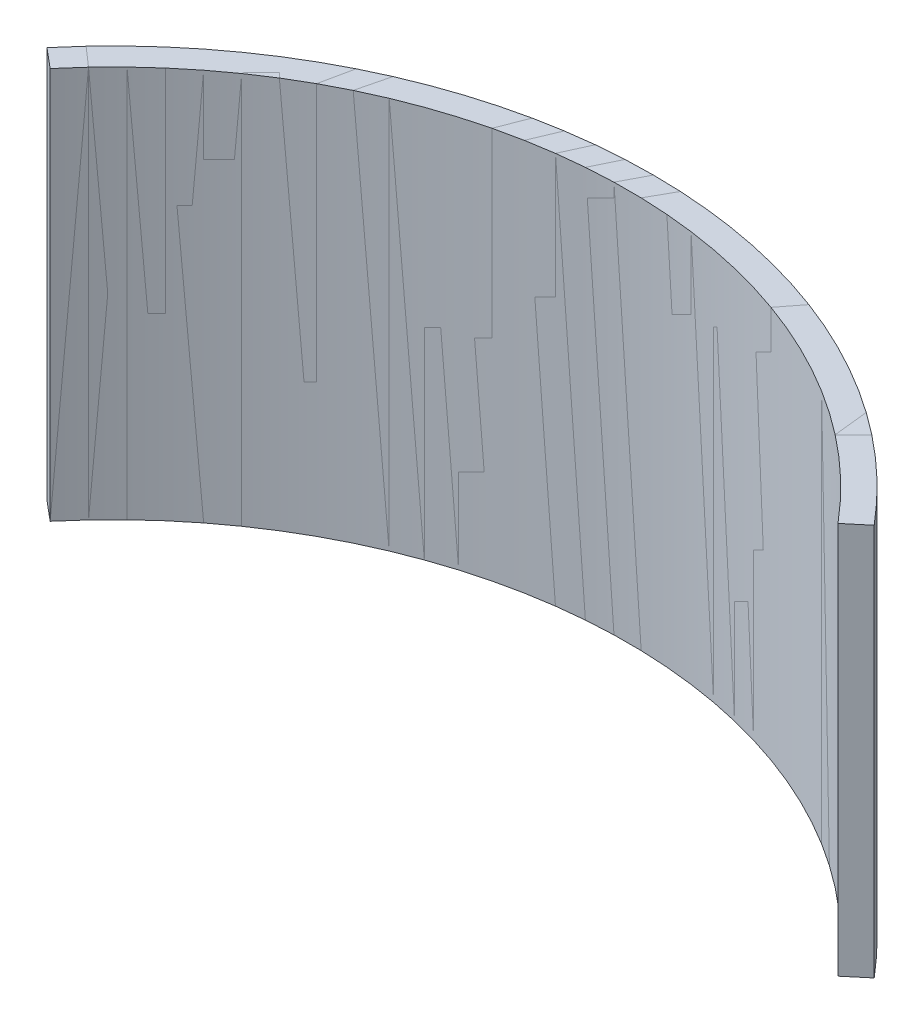
ISO-10303-21;
HEADER;
FILE_DESCRIPTION(('STEP AP214'),'2;1');
FILE_NAME('part.step','',(''),(''),'','','');
FILE_SCHEMA(('AUTOMOTIVE_DESIGN { 1 0 10303 214 1 1 1 1 }'));
ENDSEC;
DATA;
#1=APPLICATION_CONTEXT('core data for automotive mechanical design processes');
#2=APPLICATION_PROTOCOL_DEFINITION('international standard','automotive_design',2000,#1);
#3=PRODUCT_CONTEXT('',#1,'mechanical');
#4=PRODUCT('Part','Part','',(#3));
#5=PRODUCT_RELATED_PRODUCT_CATEGORY('part','',(#4));
#6=PRODUCT_DEFINITION_FORMATION('','',#4);
#7=PRODUCT_DEFINITION_CONTEXT('part definition',#1,'design');
#8=PRODUCT_DEFINITION('design','',#6,#7);
#9=PRODUCT_DEFINITION_SHAPE('','',#8);
#10=(LENGTH_UNIT() NAMED_UNIT(*) SI_UNIT(.MILLI.,.METRE.));
#11=(NAMED_UNIT(*) PLANE_ANGLE_UNIT() SI_UNIT($,.RADIAN.));
#12=(NAMED_UNIT(*) SI_UNIT($,.STERADIAN.) SOLID_ANGLE_UNIT());
#13=UNCERTAINTY_MEASURE_WITH_UNIT(LENGTH_MEASURE(1.E-05),#10,'distance_accuracy_value','');
#14=(GEOMETRIC_REPRESENTATION_CONTEXT(3) GLOBAL_UNCERTAINTY_ASSIGNED_CONTEXT((#13)) GLOBAL_UNIT_ASSIGNED_CONTEXT((#10,
#11,#12)) REPRESENTATION_CONTEXT('',''));
#15=CARTESIAN_POINT('',(0.,0.,0.));
#16=DIRECTION('',(0.,0.,1.));
#17=DIRECTION('',(1.,0.,0.));
#18=AXIS2_PLACEMENT_3D('',#15,#16,#17);
#19=CARTESIAN_POINT('',(30.6417777247592,17.,-25.7115043874616));
#20=DIRECTION('',(0.,1.,0.));
#21=DIRECTION('',(0.,0.,1.));
#22=AXIS2_PLACEMENT_3D('',#19,#20,#21);
#23=PLANE('',#22);
#24=DIRECTION('',(-0.766044443118979,0.,-0.642787609686538));
#25=VECTOR('',#24,1.);
#26=CARTESIAN_POINT('',(-30.6417777247592,17.,-25.7115043874616));
#27=LINE('',#26,#25);
#28=CARTESIAN_POINT('',(-30.6417777247592,17.,-25.7115043874616));
#29=VERTEX_POINT('',#28);
#30=CARTESIAN_POINT('',(-32.1738666109971,17.,-26.9970796068346));
#31=VERTEX_POINT('',#30);
#32=EDGE_CURVE('E92',#29,#31,#27,.T.);
#33=ORIENTED_EDGE('',*,*,#32,.T.);
#34=CARTESIAN_POINT('',(0.,17.,0.));
#35=DIRECTION('',(0.,1.,0.));
#36=DIRECTION('',(0.,0.,1.));
#37=AXIS2_PLACEMENT_3D('',#34,#35,#36);
#38=CIRCLE('',#37,42.);
#39=CARTESIAN_POINT('',(32.1738666109971,17.,-26.9970796068346));
#40=VERTEX_POINT('',#39);
#41=EDGE_CURVE('E142',#31,#40,#38,.F.);
#42=ORIENTED_EDGE('',*,*,#41,.T.);
#43=DIRECTION('',(0.766044443118979,0.,-0.642787609686538));
#44=VECTOR('',#43,1.);
#45=CARTESIAN_POINT('',(30.6417777247592,17.,-25.7115043874616));
#46=LINE('',#45,#44);
#47=CARTESIAN_POINT('',(30.6417777247592,17.,-25.7115043874616));
#48=VERTEX_POINT('',#47);
#49=EDGE_CURVE('E112',#48,#40,#46,.T.);
#50=ORIENTED_EDGE('',*,*,#49,.F.);
#51=CARTESIAN_POINT('',(0.,17.,0.));
#52=DIRECTION('',(0.,1.,0.));
#53=DIRECTION('',(0.,0.,1.));
#54=AXIS2_PLACEMENT_3D('',#51,#52,#53);
#55=CIRCLE('',#54,40.0000000000001);
#56=EDGE_CURVE('E110',#48,#29,#55,.T.);
#57=ORIENTED_EDGE('',*,*,#56,.T.);
#58=EDGE_LOOP('',(#33,#42,#50,#57));
#59=FACE_BOUND('',#58,.T.);
#60=ADVANCED_FACE('F68',(#59),#23,.F.);
#61=CARTESIAN_POINT('',(0.,0.,0.));
#62=DIRECTION('',(0.642787609686538,0.,0.766044443118979));
#63=DIRECTION('',(0.766044443118979,0.,-0.642787609686538));
#64=AXIS2_PLACEMENT_3D('',#61,#62,#63);
#65=PLANE('',#64);
#66=DIRECTION('',(0.,-1.,0.));
#67=VECTOR('',#66,1.);
#68=CARTESIAN_POINT('',(32.1738666109971,2.,-26.9970796068346));
#69=LINE('',#68,#67);
#70=CARTESIAN_POINT('',(32.1738666109971,47.5,-26.9970796068346));
#71=VERTEX_POINT('',#70);
#72=EDGE_CURVE('E77',#71,#40,#69,.T.);
#73=ORIENTED_EDGE('',*,*,#72,.F.);
#74=DIRECTION('',(-0.766044443118979,0.,0.642787609686538));
#75=VECTOR('',#74,1.);
#76=CARTESIAN_POINT('',(30.6417777247592,47.5,-25.7115043874616));
#77=LINE('',#76,#75);
#78=CARTESIAN_POINT('',(30.6417777247592,47.5,-25.7115043874615));
#79=VERTEX_POINT('',#78);
#80=EDGE_CURVE('E85',#71,#79,#77,.T.);
#81=ORIENTED_EDGE('',*,*,#80,.T.);
#82=DIRECTION('',(0.,-1.,0.));
#83=VECTOR('',#82,1.);
#84=CARTESIAN_POINT('',(30.6417777247592,47.5,-25.7115043874616));
#85=LINE('',#84,#83);
#86=EDGE_CURVE('E130',#79,#48,#85,.T.);
#87=ORIENTED_EDGE('',*,*,#86,.T.);
#88=ORIENTED_EDGE('',*,*,#49,.T.);
#89=EDGE_LOOP('',(#73,#81,#87,#88));
#90=FACE_BOUND('',#89,.T.);
#91=ADVANCED_FACE('F152',(#90),#65,.T.);
#92=CARTESIAN_POINT('',(0.,47.5,0.));
#93=DIRECTION('',(0.,1.,0.));
#94=DIRECTION('',(0.,0.,1.));
#95=AXIS2_PLACEMENT_3D('',#92,#93,#94);
#96=PLANE('',#95);
#97=CARTESIAN_POINT('',(0.,47.5,0.));
#98=DIRECTION('',(0.,-1.,0.));
#99=DIRECTION('',(-0.766044443118978,0.,-0.642787609686539));
#100=AXIS2_PLACEMENT_3D('',#97,#98,#99);
#101=CIRCLE('',#100,40.);
#102=CARTESIAN_POINT('',(-30.6417777247592,47.5,-25.7115043874616));
#103=VERTEX_POINT('',#102);
#104=EDGE_CURVE('E13',#103,#79,#101,.T.);
#105=ORIENTED_EDGE('',*,*,#104,.T.);
#106=ORIENTED_EDGE('',*,*,#80,.F.);
#107=CARTESIAN_POINT('',(0.,47.5,0.));
#108=DIRECTION('',(0.,-1.,0.));
#109=DIRECTION('',(0.,0.,-1.));
#110=AXIS2_PLACEMENT_3D('',#107,#108,#109);
#111=CIRCLE('',#110,42.);
#112=CARTESIAN_POINT('',(-32.1738666109971,47.5,-26.9970796068346));
#113=VERTEX_POINT('',#112);
#114=EDGE_CURVE('E141',#71,#113,#111,.F.);
#115=ORIENTED_EDGE('',*,*,#114,.T.);
#116=DIRECTION('',(0.766044443118979,0.,0.642787609686538));
#117=VECTOR('',#116,1.);
#118=CARTESIAN_POINT('',(-30.6417777247592,47.5,-25.7115043874616));
#119=LINE('',#118,#117);
#120=EDGE_CURVE('E126',#113,#103,#119,.T.);
#121=ORIENTED_EDGE('',*,*,#120,.T.);
#122=EDGE_LOOP('',(#105,#106,#115,#121));
#123=FACE_BOUND('',#122,.T.);
#124=ADVANCED_FACE('F70',(#123),#96,.T.);
#125=CARTESIAN_POINT('',(0.,17.,0.));
#126=DIRECTION('',(0.,-1.,0.));
#127=DIRECTION('',(0.,0.,-1.));
#128=AXIS2_PLACEMENT_3D('',#125,#126,#127);
#129=CYLINDRICAL_SURFACE('',#128,40.);
#130=ORIENTED_EDGE('',*,*,#86,.F.);
#131=ORIENTED_EDGE('',*,*,#104,.F.);
#132=DIRECTION('',(0.,-1.,0.));
#133=VECTOR('',#132,1.);
#134=CARTESIAN_POINT('',(-30.6417777247592,47.5,-25.7115043874616));
#135=LINE('',#134,#133);
#136=EDGE_CURVE('E72',#103,#29,#135,.T.);
#137=ORIENTED_EDGE('',*,*,#136,.T.);
#138=ORIENTED_EDGE('',*,*,#56,.F.);
#139=EDGE_LOOP('',(#130,#131,#137,#138));
#140=FACE_BOUND('',#139,.T.);
#141=ADVANCED_FACE('F118',(#140),#129,.F.);
#142=CARTESIAN_POINT('',(0.,0.,0.));
#143=DIRECTION('',(0.642787609686538,0.,-0.766044443118979));
#144=DIRECTION('',(-0.766044443118979,0.,-0.642787609686538));
#145=AXIS2_PLACEMENT_3D('',#142,#143,#144);
#146=PLANE('',#145);
#147=ORIENTED_EDGE('',*,*,#120,.F.);
#148=DIRECTION('',(0.,-1.,0.));
#149=VECTOR('',#148,1.);
#150=CARTESIAN_POINT('',(-32.1738666109971,2.,-26.9970796068346));
#151=LINE('',#150,#149);
#152=EDGE_CURVE('E115',#113,#31,#151,.T.);
#153=ORIENTED_EDGE('',*,*,#152,.T.);
#154=ORIENTED_EDGE('',*,*,#32,.F.);
#155=ORIENTED_EDGE('',*,*,#136,.F.);
#156=EDGE_LOOP('',(#147,#153,#154,#155));
#157=FACE_BOUND('',#156,.T.);
#158=ADVANCED_FACE('F122',(#157),#146,.F.);
#159=CARTESIAN_POINT('',(0.,17.,0.));
#160=DIRECTION('',(0.,-1.,0.));
#161=DIRECTION('',(0.,0.,-1.));
#162=AXIS2_PLACEMENT_3D('',#159,#160,#161);
#163=CYLINDRICAL_SURFACE('',#162,42.);
#164=ORIENTED_EDGE('',*,*,#41,.F.);
#165=ORIENTED_EDGE('',*,*,#152,.F.);
#166=ORIENTED_EDGE('',*,*,#114,.F.);
#167=ORIENTED_EDGE('',*,*,#72,.T.);
#168=EDGE_LOOP('',(#164,#165,#166,#167));
#169=FACE_BOUND('',#168,.T.);
#170=ADVANCED_FACE('F151',(#169),#163,.T.);
#171=CLOSED_SHELL('',(#60,#91,#124,#141,#158,#170));
#172=MANIFOLD_SOLID_BREP('B2',#171);
#173=CARTESIAN_POINT('',(0.,17.,0.));
#174=DIRECTION('',(0.,-1.,0.));
#175=DIRECTION('',(0.,0.,-1.));
#176=AXIS2_PLACEMENT_3D('',#173,#174,#175);
#177=CYLINDRICAL_SURFACE('',#176,40.);
#178=DIRECTION('',(0.,1.,0.));
#179=VECTOR('',#178,1.);
#180=CARTESIAN_POINT('',(30.6417777247592,17.,-25.7115043874616));
#181=LINE('',#180,#179);
#182=CARTESIAN_POINT('',(30.6417777247592,17.,-25.7115043874616));
#183=VERTEX_POINT('',#182);
#184=CARTESIAN_POINT('',(30.6417777247592,47.5,-25.7115043874615));
#185=VERTEX_POINT('',#184);
#186=EDGE_CURVE('E66',#183,#185,#181,.T.);
#187=ORIENTED_EDGE('',*,*,#186,.F.);
#188=CARTESIAN_POINT('',(0.,17.,0.));
#189=DIRECTION('',(0.,-1.,0.));
#190=DIRECTION('',(-0.766044443118978,0.,-0.642787609686539));
#191=AXIS2_PLACEMENT_3D('',#188,#189,#190);
#192=CIRCLE('',#191,40.0000000000001);
#193=CARTESIAN_POINT('',(-30.6417777247592,17.,-25.7115043874616));
#194=VERTEX_POINT('',#193);
#195=EDGE_CURVE('E221',#194,#183,#192,.T.);
#196=ORIENTED_EDGE('',*,*,#195,.F.);
#197=DIRECTION('',(0.,1.,0.));
#198=VECTOR('',#197,1.);
#199=CARTESIAN_POINT('',(-30.6417777247592,17.,-25.7115043874616));
#200=LINE('',#199,#198);
#201=CARTESIAN_POINT('',(-30.6417777247591,47.5,-25.7115043874615));
#202=VERTEX_POINT('',#201);
#203=EDGE_CURVE('E267',#194,#202,#200,.T.);
#204=ORIENTED_EDGE('',*,*,#203,.T.);
#205=CARTESIAN_POINT('',(0.,47.5,0.));
#206=DIRECTION('',(0.,-1.,0.));
#207=DIRECTION('',(-0.766044443118978,0.,-0.642787609686539));
#208=AXIS2_PLACEMENT_3D('',#205,#206,#207);
#209=CIRCLE('',#208,40.);
#210=EDGE_CURVE('E268',#202,#185,#209,.T.);
#211=ORIENTED_EDGE('',*,*,#210,.T.);
#212=EDGE_LOOP('',(#187,#196,#204,#211));
#213=FACE_BOUND('',#212,.T.);
#214=ADVANCED_FACE('F215',(#213),#177,.T.);
#215=CARTESIAN_POINT('',(-32.1738666109971,17.,-26.9970796068346));
#216=DIRECTION('',(0.,1.,0.));
#217=DIRECTION('',(0.,0.,1.));
#218=AXIS2_PLACEMENT_3D('',#215,#216,#217);
#219=PLANE('',#218);
#220=ORIENTED_EDGE('',*,*,#195,.T.);
#221=DIRECTION('',(-0.76604444311898,0.,0.642787609686537));
#222=VECTOR('',#221,1.);
#223=CARTESIAN_POINT('',(32.1738666109971,17.,-26.9970796068346));
#224=LINE('',#223,#222);
#225=CARTESIAN_POINT('',(32.1738666109971,17.,-26.9970796068346));
#226=VERTEX_POINT('',#225);
#227=EDGE_CURVE('E225',#226,#183,#224,.T.);
#228=ORIENTED_EDGE('',*,*,#227,.F.);
#229=CARTESIAN_POINT('',(0.,17.,0.));
#230=DIRECTION('',(0.,-1.,0.));
#231=DIRECTION('',(-0.766044443118978,0.,-0.642787609686539));
#232=AXIS2_PLACEMENT_3D('',#229,#230,#231);
#233=CIRCLE('',#232,42.);
#234=CARTESIAN_POINT('',(-32.1738666109971,17.,-26.9970796068346));
#235=VERTEX_POINT('',#234);
#236=EDGE_CURVE('E284',#235,#226,#233,.T.);
#237=ORIENTED_EDGE('',*,*,#236,.F.);
#238=DIRECTION('',(0.766044443118978,0.,0.64278760968654));
#239=VECTOR('',#238,1.);
#240=CARTESIAN_POINT('',(-32.1738666109971,17.,-26.9970796068346));
#241=LINE('',#240,#239);
#242=EDGE_CURVE('E241',#235,#194,#241,.T.);
#243=ORIENTED_EDGE('',*,*,#242,.T.);
#244=EDGE_LOOP('',(#220,#228,#237,#243));
#245=FACE_BOUND('',#244,.T.);
#246=ADVANCED_FACE('F290',(#245),#219,.T.);
#247=CARTESIAN_POINT('',(0.,17.,0.));
#248=DIRECTION('',(0.,-1.,0.));
#249=DIRECTION('',(0.,0.,-1.));
#250=AXIS2_PLACEMENT_3D('',#247,#248,#249);
#251=CYLINDRICAL_SURFACE('',#250,42.);
#252=ORIENTED_EDGE('',*,*,#236,.T.);
#253=DIRECTION('',(0.,-1.,0.));
#254=VECTOR('',#253,1.);
#255=CARTESIAN_POINT('',(32.1738666109971,47.5,-26.9970796068346));
#256=LINE('',#255,#254);
#257=CARTESIAN_POINT('',(32.1738666109971,47.5,-26.9970796068346));
#258=VERTEX_POINT('',#257);
#259=EDGE_CURVE('E281',#258,#226,#256,.T.);
#260=ORIENTED_EDGE('',*,*,#259,.F.);
#261=CARTESIAN_POINT('',(0.,47.5,0.));
#262=DIRECTION('',(0.,-1.,0.));
#263=DIRECTION('',(-0.766044443118978,0.,-0.642787609686539));
#264=AXIS2_PLACEMENT_3D('',#261,#262,#263);
#265=CIRCLE('',#264,42.);
#266=CARTESIAN_POINT('',(-32.1738666109971,47.5,-26.9970796068346));
#267=VERTEX_POINT('',#266);
#268=EDGE_CURVE('E275',#267,#258,#265,.T.);
#269=ORIENTED_EDGE('',*,*,#268,.F.);
#270=DIRECTION('',(0.,-1.,0.));
#271=VECTOR('',#270,1.);
#272=CARTESIAN_POINT('',(-32.1738666109971,47.5,-26.9970796068346));
#273=LINE('',#272,#271);
#274=EDGE_CURVE('E251',#267,#235,#273,.T.);
#275=ORIENTED_EDGE('',*,*,#274,.T.);
#276=EDGE_LOOP('',(#252,#260,#269,#275));
#277=FACE_BOUND('',#276,.T.);
#278=ADVANCED_FACE('F292',(#277),#251,.F.);
#279=CARTESIAN_POINT('',(-30.6417777247591,47.5,-25.7115043874616));
#280=DIRECTION('',(0.,-1.,0.));
#281=DIRECTION('',(0.,0.,-1.));
#282=AXIS2_PLACEMENT_3D('',#279,#280,#281);
#283=PLANE('',#282);
#284=ORIENTED_EDGE('',*,*,#268,.T.);
#285=DIRECTION('',(0.76604444311898,0.,-0.642787609686537));
#286=VECTOR('',#285,1.);
#287=CARTESIAN_POINT('',(30.6417777247592,47.5,-25.7115043874615));
#288=LINE('',#287,#286);
#289=EDGE_CURVE('E272',#185,#258,#288,.T.);
#290=ORIENTED_EDGE('',*,*,#289,.F.);
#291=ORIENTED_EDGE('',*,*,#210,.F.);
#292=DIRECTION('',(-0.766044443118978,0.,-0.64278760968654));
#293=VECTOR('',#292,1.);
#294=CARTESIAN_POINT('',(-30.6417777247591,47.5,-25.7115043874616));
#295=LINE('',#294,#293);
#296=EDGE_CURVE('E259',#202,#267,#295,.T.);
#297=ORIENTED_EDGE('',*,*,#296,.T.);
#298=EDGE_LOOP('',(#284,#290,#291,#297));
#299=FACE_BOUND('',#298,.T.);
#300=ADVANCED_FACE('F270',(#299),#283,.T.);
#301=OPEN_SHELL('',(#214,#246,#278,#300));
#302=SHELL_BASED_SURFACE_MODEL('B7',(#301));
#303=ADVANCED_BREP_SHAPE_REPRESENTATION('',(#18,#172),#14);
#304=MANIFOLD_SURFACE_SHAPE_REPRESENTATION('',(#18,#302),#14);
#305=SHAPE_REPRESENTATION('',(#18),#14);
#306=SHAPE_DEFINITION_REPRESENTATION(#9,#305);
#307=SHAPE_REPRESENTATION_RELATIONSHIP('','',#305,#303);
#308=SHAPE_REPRESENTATION_RELATIONSHIP('','',#305,#304);
ENDSEC;
END-ISO-10303-21;
